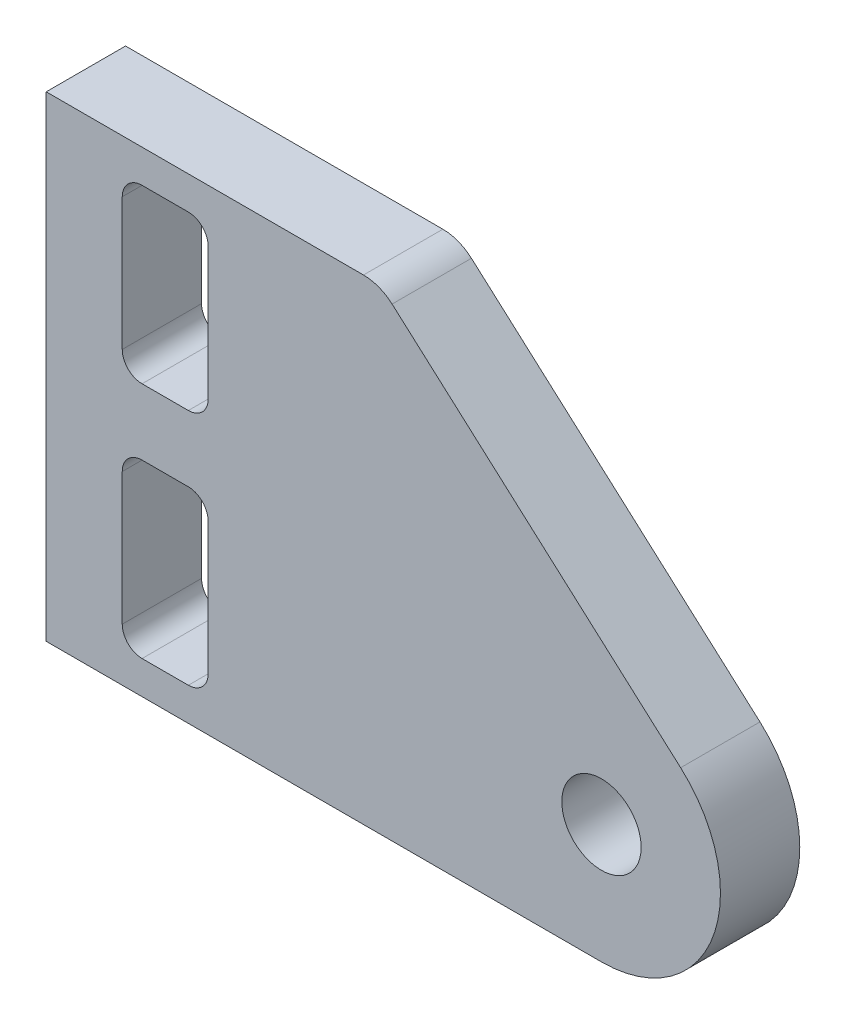
ISO-10303-21;
HEADER;
FILE_DESCRIPTION(('STEP AP214'),'2;1');
FILE_NAME('part.step','',(''),(''),'','','');
FILE_SCHEMA(('AUTOMOTIVE_DESIGN { 1 0 10303 214 1 1 1 1 }'));
ENDSEC;
DATA;
#1=APPLICATION_CONTEXT('core data for automotive mechanical design processes');
#2=APPLICATION_PROTOCOL_DEFINITION('international standard','automotive_design',2000,#1);
#3=PRODUCT_CONTEXT('',#1,'mechanical');
#4=PRODUCT('Part','Part','',(#3));
#5=PRODUCT_RELATED_PRODUCT_CATEGORY('part','',(#4));
#6=PRODUCT_DEFINITION_FORMATION('','',#4);
#7=PRODUCT_DEFINITION_CONTEXT('part definition',#1,'design');
#8=PRODUCT_DEFINITION('design','',#6,#7);
#9=PRODUCT_DEFINITION_SHAPE('','',#8);
#10=(LENGTH_UNIT() NAMED_UNIT(*) SI_UNIT(.MILLI.,.METRE.));
#11=(NAMED_UNIT(*) PLANE_ANGLE_UNIT() SI_UNIT($,.RADIAN.));
#12=(NAMED_UNIT(*) SI_UNIT($,.STERADIAN.) SOLID_ANGLE_UNIT());
#13=UNCERTAINTY_MEASURE_WITH_UNIT(LENGTH_MEASURE(1.E-05),#10,'distance_accuracy_value','');
#14=(GEOMETRIC_REPRESENTATION_CONTEXT(3) GLOBAL_UNCERTAINTY_ASSIGNED_CONTEXT((#13)) GLOBAL_UNIT_ASSIGNED_CONTEXT((#10,
#11,#12)) REPRESENTATION_CONTEXT('',''));
#15=CARTESIAN_POINT('',(0.,0.,0.));
#16=DIRECTION('',(0.,0.,1.));
#17=DIRECTION('',(1.,0.,0.));
#18=AXIS2_PLACEMENT_3D('',#15,#16,#17);
#19=CARTESIAN_POINT('',(201.097853309265,269.1465473352,3.));
#20=DIRECTION('',(0.,0.,1.));
#21=DIRECTION('',(1.,0.,0.));
#22=AXIS2_PLACEMENT_3D('',#19,#20,#21);
#23=PLANE('',#22);
#24=DIRECTION('',(1.,0.,0.));
#25=VECTOR('',#24,1.);
#26=CARTESIAN_POINT('',(183.7228533093,265.8965473352,3.));
#27=LINE('',#26,#25);
#28=CARTESIAN_POINT('',(183.7228533093,265.8965473352,3.));
#29=VERTEX_POINT('',#28);
#30=CARTESIAN_POINT('',(185.4728533093,265.8965473352,3.));
#31=VERTEX_POINT('',#30);
#32=EDGE_CURVE('E249',#29,#31,#27,.T.);
#33=ORIENTED_EDGE('',*,*,#32,.F.);
#34=CARTESIAN_POINT('',(183.7228533093,266.6465473352,3.));
#35=DIRECTION('',(0.,0.,1.));
#36=DIRECTION('',(1.,0.,0.));
#37=AXIS2_PLACEMENT_3D('',#34,#35,#36);
#38=CIRCLE('',#37,0.749999999999987);
#39=CARTESIAN_POINT('',(182.9728533093,266.6465473352,3.));
#40=VERTEX_POINT('',#39);
#41=EDGE_CURVE('E247',#40,#29,#38,.T.);
#42=ORIENTED_EDGE('',*,*,#41,.F.);
#43=DIRECTION('',(0.,-1.,0.));
#44=VECTOR('',#43,1.);
#45=CARTESIAN_POINT('',(182.9728533093,271.6465473352,3.));
#46=LINE('',#45,#44);
#47=CARTESIAN_POINT('',(182.9728533093,271.6465473352,3.));
#48=VERTEX_POINT('',#47);
#49=EDGE_CURVE('E263',#48,#40,#46,.T.);
#50=ORIENTED_EDGE('',*,*,#49,.F.);
#51=CARTESIAN_POINT('',(183.7228533093,271.6465473352,3.));
#52=DIRECTION('',(0.,0.,1.));
#53=DIRECTION('',(1.,0.,0.));
#54=AXIS2_PLACEMENT_3D('',#51,#52,#53);
#55=CIRCLE('',#54,0.750000000000015);
#56=CARTESIAN_POINT('',(183.7228533093,272.3965473352,3.));
#57=VERTEX_POINT('',#56);
#58=EDGE_CURVE('E260',#57,#48,#55,.T.);
#59=ORIENTED_EDGE('',*,*,#58,.F.);
#60=DIRECTION('',(-1.,0.,0.));
#61=VECTOR('',#60,1.);
#62=CARTESIAN_POINT('',(185.4728533093,272.3965473352,3.));
#63=LINE('',#62,#61);
#64=CARTESIAN_POINT('',(185.4728533093,272.3965473352,3.));
#65=VERTEX_POINT('',#64);
#66=EDGE_CURVE('E258',#65,#57,#63,.T.);
#67=ORIENTED_EDGE('',*,*,#66,.F.);
#68=CARTESIAN_POINT('',(185.4728533093,271.6465473352,3.));
#69=DIRECTION('',(0.,0.,1.));
#70=DIRECTION('',(1.,0.,0.));
#71=AXIS2_PLACEMENT_3D('',#68,#69,#70);
#72=CIRCLE('',#71,0.750000000000015);
#73=CARTESIAN_POINT('',(186.2228533093,271.6465473352,3.));
#74=VERTEX_POINT('',#73);
#75=EDGE_CURVE('E256',#74,#65,#72,.T.);
#76=ORIENTED_EDGE('',*,*,#75,.F.);
#77=DIRECTION('',(0.,1.,0.));
#78=VECTOR('',#77,1.);
#79=CARTESIAN_POINT('',(186.2228533093,266.6465473352,3.));
#80=LINE('',#79,#78);
#81=CARTESIAN_POINT('',(186.2228533093,266.6465473352,3.));
#82=VERTEX_POINT('',#81);
#83=EDGE_CURVE('E254',#82,#74,#80,.T.);
#84=ORIENTED_EDGE('',*,*,#83,.F.);
#85=CARTESIAN_POINT('',(185.4728533093,266.6465473352,3.));
#86=DIRECTION('',(0.,0.,1.));
#87=DIRECTION('',(1.,0.,0.));
#88=AXIS2_PLACEMENT_3D('',#85,#86,#87);
#89=CIRCLE('',#88,0.749999999999987);
#90=EDGE_CURVE('E252',#31,#82,#89,.T.);
#91=ORIENTED_EDGE('',*,*,#90,.F.);
#92=EDGE_LOOP('',(#33,#42,#50,#59,#67,#76,#84,#91));
#93=FACE_BOUND('',#92,.T.);
#94=CARTESIAN_POINT('',(201.097853309265,269.1465473352,3.));
#95=DIRECTION('',(0.,0.,1.));
#96=DIRECTION('',(1.,0.,0.));
#97=AXIS2_PLACEMENT_3D('',#94,#95,#96);
#98=CIRCLE('',#97,4.49999999999994);
#99=CARTESIAN_POINT('',(201.0978533093,264.6465473352,3.));
#100=VERTEX_POINT('',#99);
#101=CARTESIAN_POINT('',(204.0923677008,272.5055477161,3.));
#102=VERTEX_POINT('',#101);
#103=EDGE_CURVE('E312',#100,#102,#98,.T.);
#104=ORIENTED_EDGE('',*,*,#103,.T.);
#105=DIRECTION('',(-0.746444529098559,0.665447642552614,0.));
#106=VECTOR('',#105,1.);
#107=CARTESIAN_POINT('',(193.1792057284,282.2345196949,3.));
#108=LINE('',#107,#106);
#109=CARTESIAN_POINT('',(193.1792057284,282.2345196949,3.));
#110=VERTEX_POINT('',#109);
#111=EDGE_CURVE('E315',#102,#110,#108,.T.);
#112=ORIENTED_EDGE('',*,*,#111,.T.);
#113=CARTESIAN_POINT('',(192.097853309156,281.0215473352,3.));
#114=DIRECTION('',(0.,0.,1.));
#115=DIRECTION('',(1.,0.,0.));
#116=AXIS2_PLACEMENT_3D('',#113,#114,#115);
#117=CIRCLE('',#116,1.62499999999999);
#118=CARTESIAN_POINT('',(192.0978533093,282.6465473352,3.));
#119=VERTEX_POINT('',#118);
#120=EDGE_CURVE('E318',#110,#119,#117,.T.);
#121=ORIENTED_EDGE('',*,*,#120,.T.);
#122=DIRECTION('',(-1.,0.,0.));
#123=VECTOR('',#122,1.);
#124=CARTESIAN_POINT('',(192.0978533093,282.6465473352,3.));
#125=LINE('',#124,#123);
#126=CARTESIAN_POINT('',(180.0978533093,282.6465473352,3.));
#127=VERTEX_POINT('',#126);
#128=EDGE_CURVE('E320',#119,#127,#125,.T.);
#129=ORIENTED_EDGE('',*,*,#128,.T.);
#130=DIRECTION('',(0.,-1.,0.));
#131=VECTOR('',#130,1.);
#132=CARTESIAN_POINT('',(180.0978533093,282.6465473352,3.));
#133=LINE('',#132,#131);
#134=CARTESIAN_POINT('',(180.0978533093,264.6465473352,3.));
#135=VERTEX_POINT('',#134);
#136=EDGE_CURVE('E322',#127,#135,#133,.T.);
#137=ORIENTED_EDGE('',*,*,#136,.T.);
#138=DIRECTION('',(1.,0.,0.));
#139=VECTOR('',#138,1.);
#140=CARTESIAN_POINT('',(201.0978533093,264.6465473352,3.));
#141=LINE('',#140,#139);
#142=EDGE_CURVE('E324',#135,#100,#141,.T.);
#143=ORIENTED_EDGE('',*,*,#142,.T.);
#144=EDGE_LOOP('',(#104,#112,#121,#129,#137,#143));
#145=FACE_BOUND('',#144,.T.);
#146=CARTESIAN_POINT('',(201.097853309265,269.1465473352,3.));
#147=DIRECTION('',(0.,0.,1.));
#148=DIRECTION('',(1.,0.,0.));
#149=AXIS2_PLACEMENT_3D('',#146,#147,#148);
#150=CIRCLE('',#149,1.50000000003547);
#151=CARTESIAN_POINT('',(202.5978533093,269.1465473352,3.));
#152=VERTEX_POINT('',#151);
#153=EDGE_CURVE('E306',#152,#152,#150,.T.);
#154=ORIENTED_EDGE('',*,*,#153,.F.);
#155=EDGE_LOOP('',(#154));
#156=FACE_BOUND('',#155,.T.);
#157=DIRECTION('',(1.,0.,0.));
#158=VECTOR('',#157,1.);
#159=CARTESIAN_POINT('',(183.7228533093,274.8959687639,3.));
#160=LINE('',#159,#158);
#161=CARTESIAN_POINT('',(183.7228533093,274.8959687639,3.));
#162=VERTEX_POINT('',#161);
#163=CARTESIAN_POINT('',(185.4728533093,274.8959687639,3.));
#164=VERTEX_POINT('',#163);
#165=EDGE_CURVE('E190',#162,#164,#160,.T.);
#166=ORIENTED_EDGE('',*,*,#165,.F.);
#167=CARTESIAN_POINT('',(183.7228533093,275.6459687639,3.));
#168=DIRECTION('',(0.,0.,1.));
#169=DIRECTION('',(1.,0.,0.));
#170=AXIS2_PLACEMENT_3D('',#167,#168,#169);
#171=CIRCLE('',#170,0.750000000000015);
#172=CARTESIAN_POINT('',(182.9728533093,275.6459687639,3.));
#173=VERTEX_POINT('',#172);
#174=EDGE_CURVE('E182',#173,#162,#171,.T.);
#175=ORIENTED_EDGE('',*,*,#174,.F.);
#176=DIRECTION('',(0.,-1.,0.));
#177=VECTOR('',#176,1.);
#178=CARTESIAN_POINT('',(182.9728533093,280.6459687639,3.));
#179=LINE('',#178,#177);
#180=CARTESIAN_POINT('',(182.9728533093,280.6459687639,3.));
#181=VERTEX_POINT('',#180);
#182=EDGE_CURVE('E215',#181,#173,#179,.T.);
#183=ORIENTED_EDGE('',*,*,#182,.F.);
#184=CARTESIAN_POINT('',(183.7228533093,280.6459687639,3.));
#185=DIRECTION('',(0.,0.,1.));
#186=DIRECTION('',(1.,0.,0.));
#187=AXIS2_PLACEMENT_3D('',#184,#185,#186);
#188=CIRCLE('',#187,0.750000000000015);
#189=CARTESIAN_POINT('',(183.7228533093,281.3959687639,3.));
#190=VERTEX_POINT('',#189);
#191=EDGE_CURVE('E213',#190,#181,#188,.T.);
#192=ORIENTED_EDGE('',*,*,#191,.F.);
#193=DIRECTION('',(-1.,0.,0.));
#194=VECTOR('',#193,1.);
#195=CARTESIAN_POINT('',(185.4728533093,281.3959687639,3.));
#196=LINE('',#195,#194);
#197=CARTESIAN_POINT('',(185.4728533093,281.3959687639,3.));
#198=VERTEX_POINT('',#197);
#199=EDGE_CURVE('E211',#198,#190,#196,.T.);
#200=ORIENTED_EDGE('',*,*,#199,.F.);
#201=CARTESIAN_POINT('',(185.4728533093,280.6459687639,3.));
#202=DIRECTION('',(0.,0.,1.));
#203=DIRECTION('',(1.,0.,0.));
#204=AXIS2_PLACEMENT_3D('',#201,#202,#203);
#205=CIRCLE('',#204,0.750000000000015);
#206=CARTESIAN_POINT('',(186.2228533093,280.6459687639,3.));
#207=VERTEX_POINT('',#206);
#208=EDGE_CURVE('E209',#207,#198,#205,.T.);
#209=ORIENTED_EDGE('',*,*,#208,.F.);
#210=DIRECTION('',(0.,1.,0.));
#211=VECTOR('',#210,1.);
#212=CARTESIAN_POINT('',(186.2228533093,275.6459687639,3.));
#213=LINE('',#212,#211);
#214=CARTESIAN_POINT('',(186.2228533093,275.6459687639,3.));
#215=VERTEX_POINT('',#214);
#216=EDGE_CURVE('E205',#215,#207,#213,.T.);
#217=ORIENTED_EDGE('',*,*,#216,.F.);
#218=CARTESIAN_POINT('',(185.4728533093,275.6459687639,3.));
#219=DIRECTION('',(0.,0.,1.));
#220=DIRECTION('',(1.,0.,0.));
#221=AXIS2_PLACEMENT_3D('',#218,#219,#220);
#222=CIRCLE('',#221,0.750000000000015);
#223=EDGE_CURVE('E203',#164,#215,#222,.T.);
#224=ORIENTED_EDGE('',*,*,#223,.F.);
#225=EDGE_LOOP('',(#166,#175,#183,#192,#200,#209,#217,#224));
#226=FACE_BOUND('',#225,.T.);
#227=ADVANCED_FACE('F33',(#93,#145,#156,#226),#23,.T.);
#228=CARTESIAN_POINT('',(201.097853309265,269.1465473352,0.));
#229=DIRECTION('',(0.,0.,1.));
#230=DIRECTION('',(1.,0.,0.));
#231=AXIS2_PLACEMENT_3D('',#228,#229,#230);
#232=PLANE('',#231);
#233=CARTESIAN_POINT('',(183.7228533093,266.6465473352,0.));
#234=DIRECTION('',(0.,0.,1.));
#235=DIRECTION('',(1.,0.,0.));
#236=AXIS2_PLACEMENT_3D('',#233,#234,#235);
#237=CIRCLE('',#236,0.749999999999987);
#238=CARTESIAN_POINT('',(182.9728533093,266.6465473352,0.));
#239=VERTEX_POINT('',#238);
#240=CARTESIAN_POINT('',(183.7228533093,265.8965473352,0.));
#241=VERTEX_POINT('',#240);
#242=EDGE_CURVE('E198',#239,#241,#237,.T.);
#243=ORIENTED_EDGE('',*,*,#242,.T.);
#244=DIRECTION('',(1.,0.,0.));
#245=VECTOR('',#244,1.);
#246=CARTESIAN_POINT('',(183.7228533093,265.8965473352,0.));
#247=LINE('',#246,#245);
#248=CARTESIAN_POINT('',(185.4728533093,265.8965473352,0.));
#249=VERTEX_POINT('',#248);
#250=EDGE_CURVE('E268',#241,#249,#247,.T.);
#251=ORIENTED_EDGE('',*,*,#250,.T.);
#252=CARTESIAN_POINT('',(185.4728533093,266.6465473352,0.));
#253=DIRECTION('',(0.,0.,1.));
#254=DIRECTION('',(1.,0.,0.));
#255=AXIS2_PLACEMENT_3D('',#252,#253,#254);
#256=CIRCLE('',#255,0.749999999999987);
#257=CARTESIAN_POINT('',(186.2228533093,266.6465473352,0.));
#258=VERTEX_POINT('',#257);
#259=EDGE_CURVE('E271',#249,#258,#256,.T.);
#260=ORIENTED_EDGE('',*,*,#259,.T.);
#261=DIRECTION('',(0.,1.,0.));
#262=VECTOR('',#261,1.);
#263=CARTESIAN_POINT('',(186.2228533093,266.6465473352,0.));
#264=LINE('',#263,#262);
#265=CARTESIAN_POINT('',(186.2228533093,271.6465473352,0.));
#266=VERTEX_POINT('',#265);
#267=EDGE_CURVE('E274',#258,#266,#264,.T.);
#268=ORIENTED_EDGE('',*,*,#267,.T.);
#269=CARTESIAN_POINT('',(185.4728533093,271.6465473352,0.));
#270=DIRECTION('',(0.,0.,1.));
#271=DIRECTION('',(1.,0.,0.));
#272=AXIS2_PLACEMENT_3D('',#269,#270,#271);
#273=CIRCLE('',#272,0.750000000000015);
#274=CARTESIAN_POINT('',(185.4728533093,272.3965473352,0.));
#275=VERTEX_POINT('',#274);
#276=EDGE_CURVE('E277',#266,#275,#273,.T.);
#277=ORIENTED_EDGE('',*,*,#276,.T.);
#278=DIRECTION('',(-1.,0.,0.));
#279=VECTOR('',#278,1.);
#280=CARTESIAN_POINT('',(185.4728533093,272.3965473352,0.));
#281=LINE('',#280,#279);
#282=CARTESIAN_POINT('',(183.7228533093,272.3965473352,0.));
#283=VERTEX_POINT('',#282);
#284=EDGE_CURVE('E280',#275,#283,#281,.T.);
#285=ORIENTED_EDGE('',*,*,#284,.T.);
#286=CARTESIAN_POINT('',(183.7228533093,271.6465473352,0.));
#287=DIRECTION('',(0.,0.,1.));
#288=DIRECTION('',(1.,0.,0.));
#289=AXIS2_PLACEMENT_3D('',#286,#287,#288);
#290=CIRCLE('',#289,0.750000000000015);
#291=CARTESIAN_POINT('',(182.9728533093,271.6465473352,0.));
#292=VERTEX_POINT('',#291);
#293=EDGE_CURVE('E283',#283,#292,#290,.T.);
#294=ORIENTED_EDGE('',*,*,#293,.T.);
#295=DIRECTION('',(0.,-1.,0.));
#296=VECTOR('',#295,1.);
#297=CARTESIAN_POINT('',(182.9728533093,271.6465473352,0.));
#298=LINE('',#297,#296);
#299=EDGE_CURVE('E250',#292,#239,#298,.T.);
#300=ORIENTED_EDGE('',*,*,#299,.T.);
#301=EDGE_LOOP('',(#243,#251,#260,#268,#277,#285,#294,#300));
#302=FACE_BOUND('',#301,.T.);
#303=CARTESIAN_POINT('',(201.097853309265,269.1465473352,0.));
#304=DIRECTION('',(0.,0.,1.));
#305=DIRECTION('',(1.,0.,0.));
#306=AXIS2_PLACEMENT_3D('',#303,#304,#305);
#307=CIRCLE('',#306,4.49999999999994);
#308=CARTESIAN_POINT('',(201.0978533093,264.6465473352,0.));
#309=VERTEX_POINT('',#308);
#310=CARTESIAN_POINT('',(204.0923677008,272.5055477161,0.));
#311=VERTEX_POINT('',#310);
#312=EDGE_CURVE('E309',#309,#311,#307,.T.);
#313=ORIENTED_EDGE('',*,*,#312,.F.);
#314=DIRECTION('',(1.,0.,0.));
#315=VECTOR('',#314,1.);
#316=CARTESIAN_POINT('',(201.0978533093,264.6465473352,0.));
#317=LINE('',#316,#315);
#318=CARTESIAN_POINT('',(180.0978533093,264.6465473352,0.));
#319=VERTEX_POINT('',#318);
#320=EDGE_CURVE('E316',#319,#309,#317,.T.);
#321=ORIENTED_EDGE('',*,*,#320,.F.);
#322=DIRECTION('',(0.,-1.,0.));
#323=VECTOR('',#322,1.);
#324=CARTESIAN_POINT('',(180.0978533093,282.6465473352,0.));
#325=LINE('',#324,#323);
#326=CARTESIAN_POINT('',(180.0978533093,282.6465473352,0.));
#327=VERTEX_POINT('',#326);
#328=EDGE_CURVE('E335',#327,#319,#325,.T.);
#329=ORIENTED_EDGE('',*,*,#328,.F.);
#330=DIRECTION('',(-1.,0.,0.));
#331=VECTOR('',#330,1.);
#332=CARTESIAN_POINT('',(192.0978533093,282.6465473352,0.));
#333=LINE('',#332,#331);
#334=CARTESIAN_POINT('',(192.0978533093,282.6465473352,0.));
#335=VERTEX_POINT('',#334);
#336=EDGE_CURVE('E333',#335,#327,#333,.T.);
#337=ORIENTED_EDGE('',*,*,#336,.F.);
#338=CARTESIAN_POINT('',(192.097853309156,281.0215473352,0.));
#339=DIRECTION('',(0.,0.,1.));
#340=DIRECTION('',(1.,0.,0.));
#341=AXIS2_PLACEMENT_3D('',#338,#339,#340);
#342=CIRCLE('',#341,1.62499999999999);
#343=CARTESIAN_POINT('',(193.1792057284,282.2345196949,0.));
#344=VERTEX_POINT('',#343);
#345=EDGE_CURVE('E331',#344,#335,#342,.T.);
#346=ORIENTED_EDGE('',*,*,#345,.F.);
#347=DIRECTION('',(-0.746444529098559,0.665447642552614,0.));
#348=VECTOR('',#347,1.);
#349=CARTESIAN_POINT('',(193.1792057284,282.2345196949,0.));
#350=LINE('',#349,#348);
#351=EDGE_CURVE('E329',#311,#344,#350,.T.);
#352=ORIENTED_EDGE('',*,*,#351,.F.);
#353=EDGE_LOOP('',(#313,#321,#329,#337,#346,#352));
#354=FACE_BOUND('',#353,.T.);
#355=CARTESIAN_POINT('',(201.097853309265,269.1465473352,0.));
#356=DIRECTION('',(0.,0.,1.));
#357=DIRECTION('',(1.,0.,0.));
#358=AXIS2_PLACEMENT_3D('',#355,#356,#357);
#359=CIRCLE('',#358,1.50000000003547);
#360=CARTESIAN_POINT('',(202.5978533093,269.1465473352,0.));
#361=VERTEX_POINT('',#360);
#362=EDGE_CURVE('E305',#361,#361,#359,.T.);
#363=ORIENTED_EDGE('',*,*,#362,.T.);
#364=EDGE_LOOP('',(#363));
#365=FACE_BOUND('',#364,.T.);
#366=CARTESIAN_POINT('',(183.7228533093,275.6459687639,0.));
#367=DIRECTION('',(0.,0.,1.));
#368=DIRECTION('',(1.,0.,0.));
#369=AXIS2_PLACEMENT_3D('',#366,#367,#368);
#370=CIRCLE('',#369,0.750000000000015);
#371=CARTESIAN_POINT('',(182.9728533093,275.6459687639,0.));
#372=VERTEX_POINT('',#371);
#373=CARTESIAN_POINT('',(183.7228533093,274.8959687639,0.));
#374=VERTEX_POINT('',#373);
#375=EDGE_CURVE('E56',#372,#374,#370,.T.);
#376=ORIENTED_EDGE('',*,*,#375,.T.);
#377=DIRECTION('',(1.,0.,0.));
#378=VECTOR('',#377,1.);
#379=CARTESIAN_POINT('',(183.7228533093,274.8959687639,0.));
#380=LINE('',#379,#378);
#381=CARTESIAN_POINT('',(185.4728533093,274.8959687639,0.));
#382=VERTEX_POINT('',#381);
#383=EDGE_CURVE('E197',#374,#382,#380,.T.);
#384=ORIENTED_EDGE('',*,*,#383,.T.);
#385=CARTESIAN_POINT('',(185.4728533093,275.6459687639,0.));
#386=DIRECTION('',(0.,0.,1.));
#387=DIRECTION('',(1.,0.,0.));
#388=AXIS2_PLACEMENT_3D('',#385,#386,#387);
#389=CIRCLE('',#388,0.750000000000015);
#390=CARTESIAN_POINT('',(186.2228533093,275.6459687639,0.));
#391=VERTEX_POINT('',#390);
#392=EDGE_CURVE('E219',#382,#391,#389,.T.);
#393=ORIENTED_EDGE('',*,*,#392,.T.);
#394=DIRECTION('',(0.,1.,0.));
#395=VECTOR('',#394,1.);
#396=CARTESIAN_POINT('',(186.2228533093,275.6459687639,0.));
#397=LINE('',#396,#395);
#398=CARTESIAN_POINT('',(186.2228533093,280.6459687639,0.));
#399=VERTEX_POINT('',#398);
#400=EDGE_CURVE('E222',#391,#399,#397,.T.);
#401=ORIENTED_EDGE('',*,*,#400,.T.);
#402=CARTESIAN_POINT('',(185.4728533093,280.6459687639,0.));
#403=DIRECTION('',(0.,0.,1.));
#404=DIRECTION('',(1.,0.,0.));
#405=AXIS2_PLACEMENT_3D('',#402,#403,#404);
#406=CIRCLE('',#405,0.750000000000015);
#407=CARTESIAN_POINT('',(185.4728533093,281.3959687639,0.));
#408=VERTEX_POINT('',#407);
#409=EDGE_CURVE('E225',#399,#408,#406,.T.);
#410=ORIENTED_EDGE('',*,*,#409,.T.);
#411=DIRECTION('',(-1.,0.,0.));
#412=VECTOR('',#411,1.);
#413=CARTESIAN_POINT('',(185.4728533093,281.3959687639,0.));
#414=LINE('',#413,#412);
#415=CARTESIAN_POINT('',(183.7228533093,281.3959687639,0.));
#416=VERTEX_POINT('',#415);
#417=EDGE_CURVE('E228',#408,#416,#414,.T.);
#418=ORIENTED_EDGE('',*,*,#417,.T.);
#419=CARTESIAN_POINT('',(183.7228533093,280.6459687639,0.));
#420=DIRECTION('',(0.,0.,1.));
#421=DIRECTION('',(1.,0.,0.));
#422=AXIS2_PLACEMENT_3D('',#419,#420,#421);
#423=CIRCLE('',#422,0.750000000000015);
#424=CARTESIAN_POINT('',(182.9728533093,280.6459687639,0.));
#425=VERTEX_POINT('',#424);
#426=EDGE_CURVE('E231',#416,#425,#423,.T.);
#427=ORIENTED_EDGE('',*,*,#426,.T.);
#428=DIRECTION('',(0.,-1.,0.));
#429=VECTOR('',#428,1.);
#430=CARTESIAN_POINT('',(182.9728533093,280.6459687639,0.));
#431=LINE('',#430,#429);
#432=EDGE_CURVE('E191',#425,#372,#431,.T.);
#433=ORIENTED_EDGE('',*,*,#432,.T.);
#434=EDGE_LOOP('',(#376,#384,#393,#401,#410,#418,#427,#433));
#435=FACE_BOUND('',#434,.T.);
#436=ADVANCED_FACE('F359',(#302,#354,#365,#435),#232,.F.);
#437=CARTESIAN_POINT('',(201.097853309265,269.1465473352,3.));
#438=DIRECTION('',(0.,0.,-1.));
#439=DIRECTION('',(-1.,0.,0.));
#440=AXIS2_PLACEMENT_3D('',#437,#438,#439);
#441=CYLINDRICAL_SURFACE('',#440,4.49999999999994);
#442=ORIENTED_EDGE('',*,*,#312,.T.);
#443=DIRECTION('',(0.,0.,-1.));
#444=VECTOR('',#443,1.);
#445=CARTESIAN_POINT('',(204.0923677008,272.5055477161,3.));
#446=LINE('',#445,#444);
#447=EDGE_CURVE('E11',#102,#311,#446,.T.);
#448=ORIENTED_EDGE('',*,*,#447,.F.);
#449=ORIENTED_EDGE('',*,*,#103,.F.);
#450=DIRECTION('',(0.,0.,-1.));
#451=VECTOR('',#450,1.);
#452=CARTESIAN_POINT('',(201.0978533093,264.6465473352,3.));
#453=LINE('',#452,#451);
#454=EDGE_CURVE('E326',#100,#309,#453,.T.);
#455=ORIENTED_EDGE('',*,*,#454,.T.);
#456=EDGE_LOOP('',(#442,#448,#449,#455));
#457=FACE_BOUND('',#456,.T.);
#458=ADVANCED_FACE('F35',(#457),#441,.T.);
#459=CARTESIAN_POINT('',(193.1792057284,282.2345196949,3.));
#460=DIRECTION('',(-0.665447642552613,-0.746444529098559,0.));
#461=DIRECTION('',(0.746444529098559,-0.665447642552614,0.));
#462=AXIS2_PLACEMENT_3D('',#459,#460,#461);
#463=PLANE('',#462);
#464=ORIENTED_EDGE('',*,*,#351,.T.);
#465=DIRECTION('',(0.,0.,-1.));
#466=VECTOR('',#465,1.);
#467=CARTESIAN_POINT('',(193.1792057284,282.2345196949,3.));
#468=LINE('',#467,#466);
#469=EDGE_CURVE('E41',#110,#344,#468,.T.);
#470=ORIENTED_EDGE('',*,*,#469,.F.);
#471=ORIENTED_EDGE('',*,*,#111,.F.);
#472=ORIENTED_EDGE('',*,*,#447,.T.);
#473=EDGE_LOOP('',(#464,#470,#471,#472));
#474=FACE_BOUND('',#473,.T.);
#475=ADVANCED_FACE('F377',(#474),#463,.F.);
#476=CARTESIAN_POINT('',(192.097853309156,281.0215473352,3.));
#477=DIRECTION('',(0.,0.,-1.));
#478=DIRECTION('',(-1.,0.,0.));
#479=AXIS2_PLACEMENT_3D('',#476,#477,#478);
#480=CYLINDRICAL_SURFACE('',#479,1.62499999999999);
#481=ORIENTED_EDGE('',*,*,#345,.T.);
#482=DIRECTION('',(0.,0.,-1.));
#483=VECTOR('',#482,1.);
#484=CARTESIAN_POINT('',(192.0978533093,282.6465473352,3.));
#485=LINE('',#484,#483);
#486=EDGE_CURVE('E346',#119,#335,#485,.T.);
#487=ORIENTED_EDGE('',*,*,#486,.F.);
#488=ORIENTED_EDGE('',*,*,#120,.F.);
#489=ORIENTED_EDGE('',*,*,#469,.T.);
#490=EDGE_LOOP('',(#481,#487,#488,#489));
#491=FACE_BOUND('',#490,.T.);
#492=ADVANCED_FACE('F353',(#491),#480,.T.);
#493=CARTESIAN_POINT('',(192.0978533093,282.6465473352,3.));
#494=DIRECTION('',(0.,-1.,0.));
#495=DIRECTION('',(0.,0.,-1.));
#496=AXIS2_PLACEMENT_3D('',#493,#494,#495);
#497=PLANE('',#496);
#498=ORIENTED_EDGE('',*,*,#336,.T.);
#499=DIRECTION('',(0.,0.,-1.));
#500=VECTOR('',#499,1.);
#501=CARTESIAN_POINT('',(180.0978533093,282.6465473352,3.));
#502=LINE('',#501,#500);
#503=EDGE_CURVE('E343',#127,#327,#502,.T.);
#504=ORIENTED_EDGE('',*,*,#503,.F.);
#505=ORIENTED_EDGE('',*,*,#128,.F.);
#506=ORIENTED_EDGE('',*,*,#486,.T.);
#507=EDGE_LOOP('',(#498,#504,#505,#506));
#508=FACE_BOUND('',#507,.T.);
#509=ADVANCED_FACE('F365',(#508),#497,.F.);
#510=CARTESIAN_POINT('',(180.0978533093,282.6465473352,3.));
#511=DIRECTION('',(1.,0.,0.));
#512=DIRECTION('',(0.,0.,-1.));
#513=AXIS2_PLACEMENT_3D('',#510,#511,#512);
#514=PLANE('',#513);
#515=ORIENTED_EDGE('',*,*,#328,.T.);
#516=DIRECTION('',(0.,0.,-1.));
#517=VECTOR('',#516,1.);
#518=CARTESIAN_POINT('',(180.0978533093,264.6465473352,3.));
#519=LINE('',#518,#517);
#520=EDGE_CURVE('E340',#135,#319,#519,.T.);
#521=ORIENTED_EDGE('',*,*,#520,.F.);
#522=ORIENTED_EDGE('',*,*,#136,.F.);
#523=ORIENTED_EDGE('',*,*,#503,.T.);
#524=EDGE_LOOP('',(#515,#521,#522,#523));
#525=FACE_BOUND('',#524,.T.);
#526=ADVANCED_FACE('F369',(#525),#514,.F.);
#527=CARTESIAN_POINT('',(201.0978533093,264.6465473352,3.));
#528=DIRECTION('',(0.,1.,0.));
#529=DIRECTION('',(0.,0.,1.));
#530=AXIS2_PLACEMENT_3D('',#527,#528,#529);
#531=PLANE('',#530);
#532=ORIENTED_EDGE('',*,*,#320,.T.);
#533=ORIENTED_EDGE('',*,*,#454,.F.);
#534=ORIENTED_EDGE('',*,*,#142,.F.);
#535=ORIENTED_EDGE('',*,*,#520,.T.);
#536=EDGE_LOOP('',(#532,#533,#534,#535));
#537=FACE_BOUND('',#536,.T.);
#538=ADVANCED_FACE('F380',(#537),#531,.F.);
#539=CARTESIAN_POINT('',(201.097853309265,269.1465473352,3.));
#540=DIRECTION('',(0.,0.,-1.));
#541=DIRECTION('',(-1.,0.,0.));
#542=AXIS2_PLACEMENT_3D('',#539,#540,#541);
#543=CYLINDRICAL_SURFACE('',#542,1.50000000003547);
#544=ORIENTED_EDGE('',*,*,#153,.T.);
#545=EDGE_LOOP('',(#544));
#546=FACE_BOUND('',#545,.T.);
#547=ORIENTED_EDGE('',*,*,#362,.F.);
#548=EDGE_LOOP('',(#547));
#549=FACE_BOUND('',#548,.T.);
#550=ADVANCED_FACE('F382',(#546,#549),#543,.F.);
#551=CARTESIAN_POINT('',(183.7228533093,266.6465473352,3.));
#552=DIRECTION('',(0.,0.,-1.));
#553=DIRECTION('',(-1.,0.,0.));
#554=AXIS2_PLACEMENT_3D('',#551,#552,#553);
#555=CYLINDRICAL_SURFACE('',#554,0.749999999999987);
#556=ORIENTED_EDGE('',*,*,#242,.F.);
#557=DIRECTION('',(0.,0.,-1.));
#558=VECTOR('',#557,1.);
#559=CARTESIAN_POINT('',(182.9728533093,266.6465473352,3.));
#560=LINE('',#559,#558);
#561=EDGE_CURVE('E265',#40,#239,#560,.T.);
#562=ORIENTED_EDGE('',*,*,#561,.F.);
#563=ORIENTED_EDGE('',*,*,#41,.T.);
#564=DIRECTION('',(0.,0.,-1.));
#565=VECTOR('',#564,1.);
#566=CARTESIAN_POINT('',(183.7228533093,265.8965473352,3.));
#567=LINE('',#566,#565);
#568=EDGE_CURVE('E302',#29,#241,#567,.T.);
#569=ORIENTED_EDGE('',*,*,#568,.T.);
#570=EDGE_LOOP('',(#556,#562,#563,#569));
#571=FACE_BOUND('',#570,.T.);
#572=ADVANCED_FACE('F388',(#571),#555,.F.);
#573=CARTESIAN_POINT('',(183.7228533093,265.8965473352,3.));
#574=DIRECTION('',(0.,1.,0.));
#575=DIRECTION('',(0.,0.,1.));
#576=AXIS2_PLACEMENT_3D('',#573,#574,#575);
#577=PLANE('',#576);
#578=ORIENTED_EDGE('',*,*,#250,.F.);
#579=ORIENTED_EDGE('',*,*,#568,.F.);
#580=ORIENTED_EDGE('',*,*,#32,.T.);
#581=DIRECTION('',(0.,0.,-1.));
#582=VECTOR('',#581,1.);
#583=CARTESIAN_POINT('',(185.4728533093,265.8965473352,3.));
#584=LINE('',#583,#582);
#585=EDGE_CURVE('E300',#31,#249,#584,.T.);
#586=ORIENTED_EDGE('',*,*,#585,.T.);
#587=EDGE_LOOP('',(#578,#579,#580,#586));
#588=FACE_BOUND('',#587,.T.);
#589=ADVANCED_FACE('F404',(#588),#577,.T.);
#590=CARTESIAN_POINT('',(185.4728533093,266.6465473352,3.));
#591=DIRECTION('',(0.,0.,-1.));
#592=DIRECTION('',(-1.,0.,0.));
#593=AXIS2_PLACEMENT_3D('',#590,#591,#592);
#594=CYLINDRICAL_SURFACE('',#593,0.749999999999987);
#595=ORIENTED_EDGE('',*,*,#259,.F.);
#596=ORIENTED_EDGE('',*,*,#585,.F.);
#597=ORIENTED_EDGE('',*,*,#90,.T.);
#598=DIRECTION('',(0.,0.,-1.));
#599=VECTOR('',#598,1.);
#600=CARTESIAN_POINT('',(186.2228533093,266.6465473352,3.));
#601=LINE('',#600,#599);
#602=EDGE_CURVE('E298',#82,#258,#601,.T.);
#603=ORIENTED_EDGE('',*,*,#602,.T.);
#604=EDGE_LOOP('',(#595,#596,#597,#603));
#605=FACE_BOUND('',#604,.T.);
#606=ADVANCED_FACE('F408',(#605),#594,.F.);
#607=CARTESIAN_POINT('',(186.2228533093,266.6465473352,3.));
#608=DIRECTION('',(-1.,0.,0.));
#609=DIRECTION('',(0.,0.,1.));
#610=AXIS2_PLACEMENT_3D('',#607,#608,#609);
#611=PLANE('',#610);
#612=ORIENTED_EDGE('',*,*,#267,.F.);
#613=ORIENTED_EDGE('',*,*,#602,.F.);
#614=ORIENTED_EDGE('',*,*,#83,.T.);
#615=DIRECTION('',(0.,0.,-1.));
#616=VECTOR('',#615,1.);
#617=CARTESIAN_POINT('',(186.2228533093,271.6465473352,3.));
#618=LINE('',#617,#616);
#619=EDGE_CURVE('E296',#74,#266,#618,.T.);
#620=ORIENTED_EDGE('',*,*,#619,.T.);
#621=EDGE_LOOP('',(#612,#613,#614,#620));
#622=FACE_BOUND('',#621,.T.);
#623=ADVANCED_FACE('F412',(#622),#611,.T.);
#624=CARTESIAN_POINT('',(185.4728533093,271.6465473352,3.));
#625=DIRECTION('',(0.,0.,-1.));
#626=DIRECTION('',(-1.,0.,0.));
#627=AXIS2_PLACEMENT_3D('',#624,#625,#626);
#628=CYLINDRICAL_SURFACE('',#627,0.750000000000015);
#629=ORIENTED_EDGE('',*,*,#276,.F.);
#630=ORIENTED_EDGE('',*,*,#619,.F.);
#631=ORIENTED_EDGE('',*,*,#75,.T.);
#632=DIRECTION('',(0.,0.,-1.));
#633=VECTOR('',#632,1.);
#634=CARTESIAN_POINT('',(185.4728533093,272.3965473352,3.));
#635=LINE('',#634,#633);
#636=EDGE_CURVE('E294',#65,#275,#635,.T.);
#637=ORIENTED_EDGE('',*,*,#636,.T.);
#638=EDGE_LOOP('',(#629,#630,#631,#637));
#639=FACE_BOUND('',#638,.T.);
#640=ADVANCED_FACE('F416',(#639),#628,.F.);
#641=CARTESIAN_POINT('',(185.4728533093,272.3965473352,3.));
#642=DIRECTION('',(0.,-1.,0.));
#643=DIRECTION('',(0.,0.,-1.));
#644=AXIS2_PLACEMENT_3D('',#641,#642,#643);
#645=PLANE('',#644);
#646=ORIENTED_EDGE('',*,*,#284,.F.);
#647=ORIENTED_EDGE('',*,*,#636,.F.);
#648=ORIENTED_EDGE('',*,*,#66,.T.);
#649=DIRECTION('',(0.,0.,-1.));
#650=VECTOR('',#649,1.);
#651=CARTESIAN_POINT('',(183.7228533093,272.3965473352,3.));
#652=LINE('',#651,#650);
#653=EDGE_CURVE('E292',#57,#283,#652,.T.);
#654=ORIENTED_EDGE('',*,*,#653,.T.);
#655=EDGE_LOOP('',(#646,#647,#648,#654));
#656=FACE_BOUND('',#655,.T.);
#657=ADVANCED_FACE('F420',(#656),#645,.T.);
#658=CARTESIAN_POINT('',(183.7228533093,271.6465473352,3.));
#659=DIRECTION('',(0.,0.,-1.));
#660=DIRECTION('',(-1.,0.,0.));
#661=AXIS2_PLACEMENT_3D('',#658,#659,#660);
#662=CYLINDRICAL_SURFACE('',#661,0.750000000000015);
#663=ORIENTED_EDGE('',*,*,#293,.F.);
#664=ORIENTED_EDGE('',*,*,#653,.F.);
#665=ORIENTED_EDGE('',*,*,#58,.T.);
#666=DIRECTION('',(0.,0.,-1.));
#667=VECTOR('',#666,1.);
#668=CARTESIAN_POINT('',(182.9728533093,271.6465473352,3.));
#669=LINE('',#668,#667);
#670=EDGE_CURVE('E290',#48,#292,#669,.T.);
#671=ORIENTED_EDGE('',*,*,#670,.T.);
#672=EDGE_LOOP('',(#663,#664,#665,#671));
#673=FACE_BOUND('',#672,.T.);
#674=ADVANCED_FACE('F424',(#673),#662,.F.);
#675=CARTESIAN_POINT('',(182.9728533093,271.6465473352,3.));
#676=DIRECTION('',(1.,0.,0.));
#677=DIRECTION('',(0.,0.,-1.));
#678=AXIS2_PLACEMENT_3D('',#675,#676,#677);
#679=PLANE('',#678);
#680=ORIENTED_EDGE('',*,*,#299,.F.);
#681=ORIENTED_EDGE('',*,*,#670,.F.);
#682=ORIENTED_EDGE('',*,*,#49,.T.);
#683=ORIENTED_EDGE('',*,*,#561,.T.);
#684=EDGE_LOOP('',(#680,#681,#682,#683));
#685=FACE_BOUND('',#684,.T.);
#686=ADVANCED_FACE('F428',(#685),#679,.T.);
#687=CARTESIAN_POINT('',(183.7228533093,275.6459687639,3.));
#688=DIRECTION('',(0.,0.,-1.));
#689=DIRECTION('',(-1.,0.,0.));
#690=AXIS2_PLACEMENT_3D('',#687,#688,#689);
#691=CYLINDRICAL_SURFACE('',#690,0.750000000000015);
#692=ORIENTED_EDGE('',*,*,#375,.F.);
#693=DIRECTION('',(0.,0.,-1.));
#694=VECTOR('',#693,1.);
#695=CARTESIAN_POINT('',(182.9728533093,275.6459687639,3.));
#696=LINE('',#695,#694);
#697=EDGE_CURVE('E186',#173,#372,#696,.T.);
#698=ORIENTED_EDGE('',*,*,#697,.F.);
#699=ORIENTED_EDGE('',*,*,#174,.T.);
#700=DIRECTION('',(0.,0.,-1.));
#701=VECTOR('',#700,1.);
#702=CARTESIAN_POINT('',(183.7228533093,274.8959687639,3.));
#703=LINE('',#702,#701);
#704=EDGE_CURVE('E185',#162,#374,#703,.T.);
#705=ORIENTED_EDGE('',*,*,#704,.T.);
#706=EDGE_LOOP('',(#692,#698,#699,#705));
#707=FACE_BOUND('',#706,.T.);
#708=ADVANCED_FACE('F184',(#707),#691,.F.);
#709=CARTESIAN_POINT('',(183.7228533093,274.8959687639,3.));
#710=DIRECTION('',(0.,1.,0.));
#711=DIRECTION('',(0.,0.,1.));
#712=AXIS2_PLACEMENT_3D('',#709,#710,#711);
#713=PLANE('',#712);
#714=ORIENTED_EDGE('',*,*,#383,.F.);
#715=ORIENTED_EDGE('',*,*,#704,.F.);
#716=ORIENTED_EDGE('',*,*,#165,.T.);
#717=DIRECTION('',(0.,0.,-1.));
#718=VECTOR('',#717,1.);
#719=CARTESIAN_POINT('',(185.4728533093,274.8959687639,3.));
#720=LINE('',#719,#718);
#721=EDGE_CURVE('E199',#164,#382,#720,.T.);
#722=ORIENTED_EDGE('',*,*,#721,.T.);
#723=EDGE_LOOP('',(#714,#715,#716,#722));
#724=FACE_BOUND('',#723,.T.);
#725=ADVANCED_FACE('F194',(#724),#713,.T.);
#726=CARTESIAN_POINT('',(185.4728533093,275.6459687639,3.));
#727=DIRECTION('',(0.,0.,-1.));
#728=DIRECTION('',(-1.,0.,0.));
#729=AXIS2_PLACEMENT_3D('',#726,#727,#728);
#730=CYLINDRICAL_SURFACE('',#729,0.750000000000015);
#731=ORIENTED_EDGE('',*,*,#392,.F.);
#732=ORIENTED_EDGE('',*,*,#721,.F.);
#733=ORIENTED_EDGE('',*,*,#223,.T.);
#734=DIRECTION('',(0.,0.,-1.));
#735=VECTOR('',#734,1.);
#736=CARTESIAN_POINT('',(186.2228533093,275.6459687639,3.));
#737=LINE('',#736,#735);
#738=EDGE_CURVE('E244',#215,#391,#737,.T.);
#739=ORIENTED_EDGE('',*,*,#738,.T.);
#740=EDGE_LOOP('',(#731,#732,#733,#739));
#741=FACE_BOUND('',#740,.T.);
#742=ADVANCED_FACE('F437',(#741),#730,.F.);
#743=CARTESIAN_POINT('',(186.2228533093,275.6459687639,3.));
#744=DIRECTION('',(-1.,0.,0.));
#745=DIRECTION('',(0.,0.,1.));
#746=AXIS2_PLACEMENT_3D('',#743,#744,#745);
#747=PLANE('',#746);
#748=ORIENTED_EDGE('',*,*,#400,.F.);
#749=ORIENTED_EDGE('',*,*,#738,.F.);
#750=ORIENTED_EDGE('',*,*,#216,.T.);
#751=DIRECTION('',(0.,0.,-1.));
#752=VECTOR('',#751,1.);
#753=CARTESIAN_POINT('',(186.2228533093,280.6459687639,3.));
#754=LINE('',#753,#752);
#755=EDGE_CURVE('E242',#207,#399,#754,.T.);
#756=ORIENTED_EDGE('',*,*,#755,.T.);
#757=EDGE_LOOP('',(#748,#749,#750,#756));
#758=FACE_BOUND('',#757,.T.);
#759=ADVANCED_FACE('F440',(#758),#747,.T.);
#760=CARTESIAN_POINT('',(185.4728533093,280.6459687639,3.));
#761=DIRECTION('',(0.,0.,-1.));
#762=DIRECTION('',(-1.,0.,0.));
#763=AXIS2_PLACEMENT_3D('',#760,#761,#762);
#764=CYLINDRICAL_SURFACE('',#763,0.750000000000015);
#765=ORIENTED_EDGE('',*,*,#409,.F.);
#766=ORIENTED_EDGE('',*,*,#755,.F.);
#767=ORIENTED_EDGE('',*,*,#208,.T.);
#768=DIRECTION('',(0.,0.,-1.));
#769=VECTOR('',#768,1.);
#770=CARTESIAN_POINT('',(185.4728533093,281.3959687639,3.));
#771=LINE('',#770,#769);
#772=EDGE_CURVE('E240',#198,#408,#771,.T.);
#773=ORIENTED_EDGE('',*,*,#772,.T.);
#774=EDGE_LOOP('',(#765,#766,#767,#773));
#775=FACE_BOUND('',#774,.T.);
#776=ADVANCED_FACE('F444',(#775),#764,.F.);
#777=CARTESIAN_POINT('',(185.4728533093,281.3959687639,3.));
#778=DIRECTION('',(0.,-1.,0.));
#779=DIRECTION('',(0.,0.,-1.));
#780=AXIS2_PLACEMENT_3D('',#777,#778,#779);
#781=PLANE('',#780);
#782=ORIENTED_EDGE('',*,*,#417,.F.);
#783=ORIENTED_EDGE('',*,*,#772,.F.);
#784=ORIENTED_EDGE('',*,*,#199,.T.);
#785=DIRECTION('',(0.,0.,-1.));
#786=VECTOR('',#785,1.);
#787=CARTESIAN_POINT('',(183.7228533093,281.3959687639,3.));
#788=LINE('',#787,#786);
#789=EDGE_CURVE('E238',#190,#416,#788,.T.);
#790=ORIENTED_EDGE('',*,*,#789,.T.);
#791=EDGE_LOOP('',(#782,#783,#784,#790));
#792=FACE_BOUND('',#791,.T.);
#793=ADVANCED_FACE('F448',(#792),#781,.T.);
#794=CARTESIAN_POINT('',(183.7228533093,280.6459687639,3.));
#795=DIRECTION('',(0.,0.,-1.));
#796=DIRECTION('',(-1.,0.,0.));
#797=AXIS2_PLACEMENT_3D('',#794,#795,#796);
#798=CYLINDRICAL_SURFACE('',#797,0.750000000000015);
#799=ORIENTED_EDGE('',*,*,#426,.F.);
#800=ORIENTED_EDGE('',*,*,#789,.F.);
#801=ORIENTED_EDGE('',*,*,#191,.T.);
#802=DIRECTION('',(0.,0.,-1.));
#803=VECTOR('',#802,1.);
#804=CARTESIAN_POINT('',(182.9728533093,280.6459687639,3.));
#805=LINE('',#804,#803);
#806=EDGE_CURVE('E48',#181,#425,#805,.T.);
#807=ORIENTED_EDGE('',*,*,#806,.T.);
#808=EDGE_LOOP('',(#799,#800,#801,#807));
#809=FACE_BOUND('',#808,.T.);
#810=ADVANCED_FACE('F452',(#809),#798,.F.);
#811=CARTESIAN_POINT('',(182.9728533093,280.6459687639,3.));
#812=DIRECTION('',(1.,0.,0.));
#813=DIRECTION('',(0.,0.,-1.));
#814=AXIS2_PLACEMENT_3D('',#811,#812,#813);
#815=PLANE('',#814);
#816=ORIENTED_EDGE('',*,*,#432,.F.);
#817=ORIENTED_EDGE('',*,*,#806,.F.);
#818=ORIENTED_EDGE('',*,*,#182,.T.);
#819=ORIENTED_EDGE('',*,*,#697,.T.);
#820=EDGE_LOOP('',(#816,#817,#818,#819));
#821=FACE_BOUND('',#820,.T.);
#822=ADVANCED_FACE('F456',(#821),#815,.T.);
#823=CLOSED_SHELL('',(#227,#436,#458,#475,#492,#509,#526,#538,#550,#572,#589,#606,#623,#640,
#657,#674,#686,#708,#725,#742,#759,#776,#793,#810,#822));
#824=MANIFOLD_SOLID_BREP('B2',#823);
#825=ADVANCED_BREP_SHAPE_REPRESENTATION('',(#18,#824),#14);
#826=SHAPE_DEFINITION_REPRESENTATION(#9,#825);
ENDSEC;
END-ISO-10303-21;
